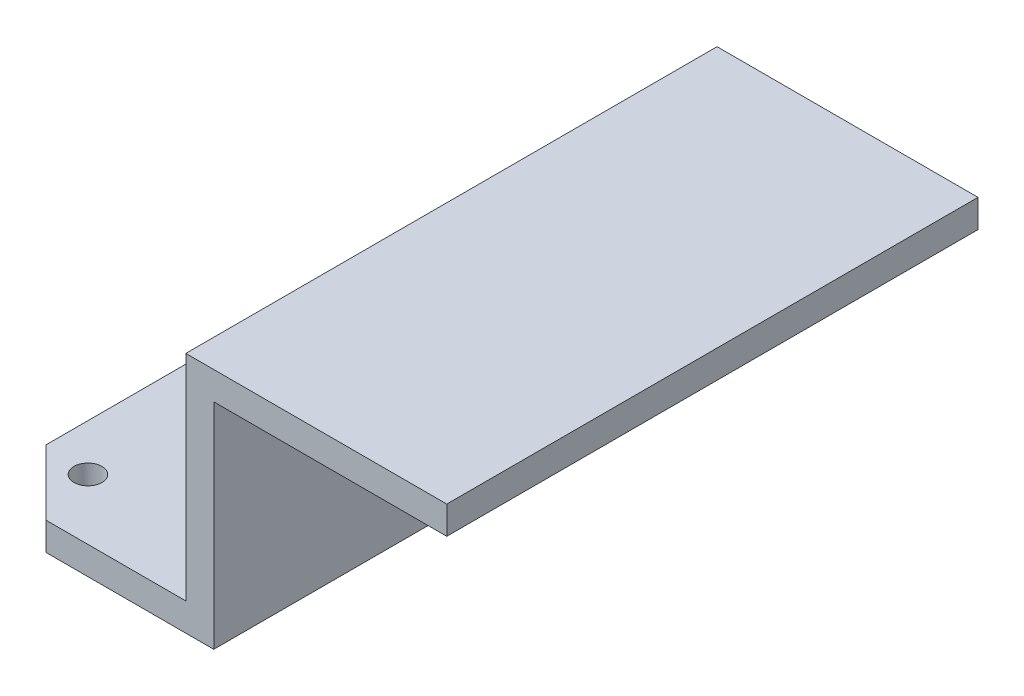
ISO-10303-21;
HEADER;
FILE_DESCRIPTION(('STEP AP214'),'2;1');
FILE_NAME('part.step','',(''),(''),'','','');
FILE_SCHEMA(('AUTOMOTIVE_DESIGN { 1 0 10303 214 1 1 1 1 }'));
ENDSEC;
DATA;
#1=APPLICATION_CONTEXT('core data for automotive mechanical design processes');
#2=APPLICATION_PROTOCOL_DEFINITION('international standard','automotive_design',2000,#1);
#3=PRODUCT_CONTEXT('',#1,'mechanical');
#4=PRODUCT('Part','Part','',(#3));
#5=PRODUCT_RELATED_PRODUCT_CATEGORY('part','',(#4));
#6=PRODUCT_DEFINITION_FORMATION('','',#4);
#7=PRODUCT_DEFINITION_CONTEXT('part definition',#1,'design');
#8=PRODUCT_DEFINITION('design','',#6,#7);
#9=PRODUCT_DEFINITION_SHAPE('','',#8);
#10=(LENGTH_UNIT() NAMED_UNIT(*) SI_UNIT(.MILLI.,.METRE.));
#11=(NAMED_UNIT(*) PLANE_ANGLE_UNIT() SI_UNIT($,.RADIAN.));
#12=(NAMED_UNIT(*) SI_UNIT($,.STERADIAN.) SOLID_ANGLE_UNIT());
#13=UNCERTAINTY_MEASURE_WITH_UNIT(LENGTH_MEASURE(1.E-05),#10,'distance_accuracy_value','');
#14=(GEOMETRIC_REPRESENTATION_CONTEXT(3) GLOBAL_UNCERTAINTY_ASSIGNED_CONTEXT((#13)) GLOBAL_UNIT_ASSIGNED_CONTEXT((#10,
#11,#12)) REPRESENTATION_CONTEXT('',''));
#15=CARTESIAN_POINT('',(0.,0.,0.));
#16=DIRECTION('',(0.,0.,1.));
#17=DIRECTION('',(1.,0.,0.));
#18=AXIS2_PLACEMENT_3D('',#15,#16,#17);
#19=CARTESIAN_POINT('',(0.,0.,57.));
#20=DIRECTION('',(0.,1.,0.));
#21=DIRECTION('',(0.,0.,1.));
#22=AXIS2_PLACEMENT_3D('',#19,#20,#21);
#23=PLANE('',#22);
#24=CARTESIAN_POINT('',(0.,0.,50.5));
#25=DIRECTION('',(0.,1.,0.));
#26=DIRECTION('',(0.,0.,1.));
#27=AXIS2_PLACEMENT_3D('',#24,#25,#26);
#28=CIRCLE('',#27,1.5);
#29=CARTESIAN_POINT('',(0.,0.,52.));
#30=VERTEX_POINT('',#29);
#31=EDGE_CURVE('E170',#30,#30,#28,.T.);
#32=ORIENTED_EDGE('',*,*,#31,.T.);
#33=EDGE_LOOP('',(#32));
#34=FACE_BOUND('',#33,.T.);
#35=CARTESIAN_POINT('',(0.,0.,6.5));
#36=DIRECTION('',(0.,1.,0.));
#37=DIRECTION('',(0.,0.,1.));
#38=AXIS2_PLACEMENT_3D('',#35,#36,#37);
#39=CIRCLE('',#38,1.5);
#40=CARTESIAN_POINT('',(0.,0.,8.));
#41=VERTEX_POINT('',#40);
#42=EDGE_CURVE('E308',#41,#41,#39,.T.);
#43=ORIENTED_EDGE('',*,*,#42,.T.);
#44=EDGE_LOOP('',(#43));
#45=FACE_BOUND('',#44,.T.);
#46=DIRECTION('',(0.,0.,-1.));
#47=VECTOR('',#46,1.);
#48=CARTESIAN_POINT('',(-5.,0.,57.));
#49=LINE('',#48,#47);
#50=CARTESIAN_POINT('',(-5.,0.,50.));
#51=VERTEX_POINT('',#50);
#52=CARTESIAN_POINT('',(-5.,0.,7.00000000000003));
#53=VERTEX_POINT('',#52);
#54=EDGE_CURVE('E166',#51,#53,#49,.T.);
#55=ORIENTED_EDGE('',*,*,#54,.T.);
#56=DIRECTION('',(0.707106781186548,0.,-0.707106781186547));
#57=VECTOR('',#56,1.);
#58=CARTESIAN_POINT('',(-5.,0.,7.00000000000001));
#59=LINE('',#58,#57);
#60=CARTESIAN_POINT('',(2.00000000000003,0.,0.));
#61=VERTEX_POINT('',#60);
#62=EDGE_CURVE('E220',#53,#61,#59,.T.);
#63=ORIENTED_EDGE('',*,*,#62,.T.);
#64=DIRECTION('',(1.,0.,0.));
#65=VECTOR('',#64,1.);
#66=CARTESIAN_POINT('',(0.,0.,0.));
#67=LINE('',#66,#65);
#68=CARTESIAN_POINT('',(20.,0.,0.));
#69=VERTEX_POINT('',#68);
#70=EDGE_CURVE('E137',#61,#69,#67,.T.);
#71=ORIENTED_EDGE('',*,*,#70,.T.);
#72=DIRECTION('',(0.,0.,-1.));
#73=VECTOR('',#72,1.);
#74=CARTESIAN_POINT('',(20.,0.,57.));
#75=LINE('',#74,#73);
#76=CARTESIAN_POINT('',(20.,0.,57.));
#77=VERTEX_POINT('',#76);
#78=EDGE_CURVE('E135',#77,#69,#75,.T.);
#79=ORIENTED_EDGE('',*,*,#78,.F.);
#80=DIRECTION('',(1.,0.,0.));
#81=VECTOR('',#80,1.);
#82=CARTESIAN_POINT('',(0.,0.,57.));
#83=LINE('',#82,#81);
#84=CARTESIAN_POINT('',(2.,0.,57.));
#85=VERTEX_POINT('',#84);
#86=EDGE_CURVE('E123',#85,#77,#83,.T.);
#87=ORIENTED_EDGE('',*,*,#86,.F.);
#88=DIRECTION('',(0.707106781186546,0.,0.707106781186549));
#89=VECTOR('',#88,1.);
#90=CARTESIAN_POINT('',(2.,0.,57.));
#91=LINE('',#90,#89);
#92=EDGE_CURVE('E217',#85,#51,#91,.F.);
#93=ORIENTED_EDGE('',*,*,#92,.T.);
#94=EDGE_LOOP('',(#55,#63,#71,#79,#87,#93));
#95=FACE_BOUND('',#94,.T.);
#96=ADVANCED_FACE('F41',(#34,#45,#95),#23,.F.);
#97=CARTESIAN_POINT('',(20.,0.,57.));
#98=DIRECTION('',(-1.,0.,0.));
#99=DIRECTION('',(0.,0.,1.));
#100=AXIS2_PLACEMENT_3D('',#97,#98,#99);
#101=PLANE('',#100);
#102=DIRECTION('',(0.,1.,0.));
#103=VECTOR('',#102,1.);
#104=CARTESIAN_POINT('',(20.,0.,0.));
#105=LINE('',#104,#103);
#106=CARTESIAN_POINT('',(20.,23.,0.));
#107=VERTEX_POINT('',#106);
#108=EDGE_CURVE('E169',#69,#107,#105,.T.);
#109=ORIENTED_EDGE('',*,*,#108,.T.);
#110=DIRECTION('',(0.,0.,-1.));
#111=VECTOR('',#110,1.);
#112=CARTESIAN_POINT('',(20.,23.,57.));
#113=LINE('',#112,#111);
#114=CARTESIAN_POINT('',(20.,23.,57.));
#115=VERTEX_POINT('',#114);
#116=EDGE_CURVE('E142',#115,#107,#113,.T.);
#117=ORIENTED_EDGE('',*,*,#116,.F.);
#118=DIRECTION('',(0.,1.,0.));
#119=VECTOR('',#118,1.);
#120=CARTESIAN_POINT('',(20.,0.,57.));
#121=LINE('',#120,#119);
#122=EDGE_CURVE('E127',#77,#115,#121,.T.);
#123=ORIENTED_EDGE('',*,*,#122,.F.);
#124=ORIENTED_EDGE('',*,*,#78,.T.);
#125=EDGE_LOOP('',(#109,#117,#123,#124));
#126=FACE_BOUND('',#125,.T.);
#127=ADVANCED_FACE('F144',(#126),#101,.F.);
#128=CARTESIAN_POINT('',(20.,23.,57.));
#129=DIRECTION('',(0.,1.,0.));
#130=DIRECTION('',(0.,0.,1.));
#131=AXIS2_PLACEMENT_3D('',#128,#129,#130);
#132=PLANE('',#131);
#133=DIRECTION('',(1.,0.,0.));
#134=VECTOR('',#133,1.);
#135=CARTESIAN_POINT('',(20.,23.,0.));
#136=LINE('',#135,#134);
#137=CARTESIAN_POINT('',(45.,23.,0.));
#138=VERTEX_POINT('',#137);
#139=EDGE_CURVE('E173',#107,#138,#136,.T.);
#140=ORIENTED_EDGE('',*,*,#139,.T.);
#141=DIRECTION('',(0.,0.,-1.));
#142=VECTOR('',#141,1.);
#143=CARTESIAN_POINT('',(45.,23.,57.));
#144=LINE('',#143,#142);
#145=CARTESIAN_POINT('',(45.,23.,57.));
#146=VERTEX_POINT('',#145);
#147=EDGE_CURVE('E205',#146,#138,#144,.T.);
#148=ORIENTED_EDGE('',*,*,#147,.F.);
#149=DIRECTION('',(1.,0.,0.));
#150=VECTOR('',#149,1.);
#151=CARTESIAN_POINT('',(20.,23.,57.));
#152=LINE('',#151,#150);
#153=EDGE_CURVE('E148',#115,#146,#152,.T.);
#154=ORIENTED_EDGE('',*,*,#153,.F.);
#155=ORIENTED_EDGE('',*,*,#116,.T.);
#156=EDGE_LOOP('',(#140,#148,#154,#155));
#157=FACE_BOUND('',#156,.T.);
#158=ADVANCED_FACE('F240',(#157),#132,.F.);
#159=CARTESIAN_POINT('',(45.,26.,57.));
#160=DIRECTION('',(-1.,0.,0.));
#161=DIRECTION('',(0.,0.,1.));
#162=AXIS2_PLACEMENT_3D('',#159,#160,#161);
#163=PLANE('',#162);
#164=DIRECTION('',(0.,1.,0.));
#165=VECTOR('',#164,1.);
#166=CARTESIAN_POINT('',(45.,26.,0.));
#167=LINE('',#166,#165);
#168=CARTESIAN_POINT('',(45.,26.,0.));
#169=VERTEX_POINT('',#168);
#170=EDGE_CURVE('E176',#138,#169,#167,.T.);
#171=ORIENTED_EDGE('',*,*,#170,.T.);
#172=DIRECTION('',(0.,0.,-1.));
#173=VECTOR('',#172,1.);
#174=CARTESIAN_POINT('',(45.,26.,57.));
#175=LINE('',#174,#173);
#176=CARTESIAN_POINT('',(45.,26.,57.));
#177=VERTEX_POINT('',#176);
#178=EDGE_CURVE('E201',#177,#169,#175,.T.);
#179=ORIENTED_EDGE('',*,*,#178,.F.);
#180=DIRECTION('',(0.,1.,0.));
#181=VECTOR('',#180,1.);
#182=CARTESIAN_POINT('',(45.,26.,57.));
#183=LINE('',#182,#181);
#184=EDGE_CURVE('E151',#146,#177,#183,.T.);
#185=ORIENTED_EDGE('',*,*,#184,.F.);
#186=ORIENTED_EDGE('',*,*,#147,.T.);
#187=EDGE_LOOP('',(#171,#179,#185,#186));
#188=FACE_BOUND('',#187,.T.);
#189=ADVANCED_FACE('F247',(#188),#163,.F.);
#190=CARTESIAN_POINT('',(17.,26.,57.));
#191=DIRECTION('',(0.,-1.,0.));
#192=DIRECTION('',(0.,0.,-1.));
#193=AXIS2_PLACEMENT_3D('',#190,#191,#192);
#194=PLANE('',#193);
#195=DIRECTION('',(-1.,0.,0.));
#196=VECTOR('',#195,1.);
#197=CARTESIAN_POINT('',(17.,26.,0.));
#198=LINE('',#197,#196);
#199=CARTESIAN_POINT('',(17.,26.,0.));
#200=VERTEX_POINT('',#199);
#201=EDGE_CURVE('E179',#169,#200,#198,.T.);
#202=ORIENTED_EDGE('',*,*,#201,.T.);
#203=DIRECTION('',(0.,0.,-1.));
#204=VECTOR('',#203,1.);
#205=CARTESIAN_POINT('',(17.,26.,57.));
#206=LINE('',#205,#204);
#207=CARTESIAN_POINT('',(17.,26.,57.));
#208=VERTEX_POINT('',#207);
#209=EDGE_CURVE('E197',#208,#200,#206,.T.);
#210=ORIENTED_EDGE('',*,*,#209,.F.);
#211=DIRECTION('',(-1.,0.,0.));
#212=VECTOR('',#211,1.);
#213=CARTESIAN_POINT('',(17.,26.,57.));
#214=LINE('',#213,#212);
#215=EDGE_CURVE('E157',#177,#208,#214,.T.);
#216=ORIENTED_EDGE('',*,*,#215,.F.);
#217=ORIENTED_EDGE('',*,*,#178,.T.);
#218=EDGE_LOOP('',(#202,#210,#216,#217));
#219=FACE_BOUND('',#218,.T.);
#220=ADVANCED_FACE('F250',(#219),#194,.F.);
#221=CARTESIAN_POINT('',(17.,3.,57.));
#222=DIRECTION('',(1.,0.,0.));
#223=DIRECTION('',(0.,0.,-1.));
#224=AXIS2_PLACEMENT_3D('',#221,#222,#223);
#225=PLANE('',#224);
#226=DIRECTION('',(0.,-1.,0.));
#227=VECTOR('',#226,1.);
#228=CARTESIAN_POINT('',(17.,3.,0.));
#229=LINE('',#228,#227);
#230=CARTESIAN_POINT('',(17.,3.,0.));
#231=VERTEX_POINT('',#230);
#232=EDGE_CURVE('E182',#200,#231,#229,.T.);
#233=ORIENTED_EDGE('',*,*,#232,.T.);
#234=DIRECTION('',(0.,0.,-1.));
#235=VECTOR('',#234,1.);
#236=CARTESIAN_POINT('',(17.,3.,57.));
#237=LINE('',#236,#235);
#238=CARTESIAN_POINT('',(17.,3.,57.));
#239=VERTEX_POINT('',#238);
#240=EDGE_CURVE('E193',#239,#231,#237,.T.);
#241=ORIENTED_EDGE('',*,*,#240,.F.);
#242=DIRECTION('',(0.,-1.,0.));
#243=VECTOR('',#242,1.);
#244=CARTESIAN_POINT('',(17.,3.,57.));
#245=LINE('',#244,#243);
#246=EDGE_CURVE('E160',#208,#239,#245,.T.);
#247=ORIENTED_EDGE('',*,*,#246,.F.);
#248=ORIENTED_EDGE('',*,*,#209,.T.);
#249=EDGE_LOOP('',(#233,#241,#247,#248));
#250=FACE_BOUND('',#249,.T.);
#251=ADVANCED_FACE('F255',(#250),#225,.F.);
#252=CARTESIAN_POINT('',(-5.,3.,57.));
#253=DIRECTION('',(0.,-1.,0.));
#254=DIRECTION('',(0.,0.,-1.));
#255=AXIS2_PLACEMENT_3D('',#252,#253,#254);
#256=PLANE('',#255);
#257=CARTESIAN_POINT('',(0.,3.,50.5));
#258=DIRECTION('',(0.,1.,0.));
#259=DIRECTION('',(0.,0.,1.));
#260=AXIS2_PLACEMENT_3D('',#257,#258,#259);
#261=CIRCLE('',#260,1.5);
#262=CARTESIAN_POINT('',(0.,3.,52.));
#263=VERTEX_POINT('',#262);
#264=EDGE_CURVE('E305',#263,#263,#261,.T.);
#265=ORIENTED_EDGE('',*,*,#264,.F.);
#266=EDGE_LOOP('',(#265));
#267=FACE_BOUND('',#266,.T.);
#268=CARTESIAN_POINT('',(0.,3.,6.5));
#269=DIRECTION('',(0.,1.,0.));
#270=DIRECTION('',(0.,0.,1.));
#271=AXIS2_PLACEMENT_3D('',#268,#269,#270);
#272=CIRCLE('',#271,1.5);
#273=CARTESIAN_POINT('',(0.,3.,8.));
#274=VERTEX_POINT('',#273);
#275=EDGE_CURVE('E313',#274,#274,#272,.T.);
#276=ORIENTED_EDGE('',*,*,#275,.F.);
#277=EDGE_LOOP('',(#276));
#278=FACE_BOUND('',#277,.T.);
#279=DIRECTION('',(-1.,0.,0.));
#280=VECTOR('',#279,1.);
#281=CARTESIAN_POINT('',(-5.,3.,0.));
#282=LINE('',#281,#280);
#283=CARTESIAN_POINT('',(2.00000000000003,3.,0.));
#284=VERTEX_POINT('',#283);
#285=EDGE_CURVE('E132',#231,#284,#282,.T.);
#286=ORIENTED_EDGE('',*,*,#285,.T.);
#287=DIRECTION('',(-0.707106781186548,0.,0.707106781186547));
#288=VECTOR('',#287,1.);
#289=CARTESIAN_POINT('',(-5.,3.,7.00000000000001));
#290=LINE('',#289,#288);
#291=CARTESIAN_POINT('',(-5.,3.,7.00000000000003));
#292=VERTEX_POINT('',#291);
#293=EDGE_CURVE('E51',#284,#292,#290,.T.);
#294=ORIENTED_EDGE('',*,*,#293,.T.);
#295=DIRECTION('',(0.,0.,-1.));
#296=VECTOR('',#295,1.);
#297=CARTESIAN_POINT('',(-5.,3.,57.));
#298=LINE('',#297,#296);
#299=CARTESIAN_POINT('',(-5.,3.,50.));
#300=VERTEX_POINT('',#299);
#301=EDGE_CURVE('E189',#300,#292,#298,.T.);
#302=ORIENTED_EDGE('',*,*,#301,.F.);
#303=DIRECTION('',(-0.707106781186546,0.,-0.707106781186549));
#304=VECTOR('',#303,1.);
#305=CARTESIAN_POINT('',(2.,3.,57.));
#306=LINE('',#305,#304);
#307=CARTESIAN_POINT('',(2.,3.,57.));
#308=VERTEX_POINT('',#307);
#309=EDGE_CURVE('E58',#300,#308,#306,.F.);
#310=ORIENTED_EDGE('',*,*,#309,.T.);
#311=DIRECTION('',(-1.,0.,0.));
#312=VECTOR('',#311,1.);
#313=CARTESIAN_POINT('',(-5.,3.,57.));
#314=LINE('',#313,#312);
#315=EDGE_CURVE('E163',#239,#308,#314,.T.);
#316=ORIENTED_EDGE('',*,*,#315,.F.);
#317=ORIENTED_EDGE('',*,*,#240,.T.);
#318=EDGE_LOOP('',(#286,#294,#302,#310,#316,#317));
#319=FACE_BOUND('',#318,.T.);
#320=ADVANCED_FACE('F228',(#267,#278,#319),#256,.F.);
#321=CARTESIAN_POINT('',(-5.,0.,57.));
#322=DIRECTION('',(1.,0.,0.));
#323=DIRECTION('',(0.,0.,-1.));
#324=AXIS2_PLACEMENT_3D('',#321,#322,#323);
#325=PLANE('',#324);
#326=ORIENTED_EDGE('',*,*,#301,.T.);
#327=DIRECTION('',(0.,-1.,0.));
#328=VECTOR('',#327,1.);
#329=CARTESIAN_POINT('',(-5.,0.,7.00000000000001));
#330=LINE('',#329,#328);
#331=EDGE_CURVE('E213',#292,#53,#330,.T.);
#332=ORIENTED_EDGE('',*,*,#331,.T.);
#333=ORIENTED_EDGE('',*,*,#54,.F.);
#334=DIRECTION('',(0.,1.,0.));
#335=VECTOR('',#334,1.);
#336=CARTESIAN_POINT('',(-5.,0.,50.));
#337=LINE('',#336,#335);
#338=EDGE_CURVE('E141',#51,#300,#337,.T.);
#339=ORIENTED_EDGE('',*,*,#338,.T.);
#340=EDGE_LOOP('',(#326,#332,#333,#339));
#341=FACE_BOUND('',#340,.T.);
#342=ADVANCED_FACE('F232',(#341),#325,.F.);
#343=CARTESIAN_POINT('',(0.,0.,57.));
#344=DIRECTION('',(0.,0.,-1.));
#345=DIRECTION('',(-1.,0.,0.));
#346=AXIS2_PLACEMENT_3D('',#343,#344,#345);
#347=PLANE('',#346);
#348=ORIENTED_EDGE('',*,*,#315,.T.);
#349=DIRECTION('',(0.,-1.,0.));
#350=VECTOR('',#349,1.);
#351=CARTESIAN_POINT('',(2.,0.,57.));
#352=LINE('',#351,#350);
#353=EDGE_CURVE('E11',#308,#85,#352,.T.);
#354=ORIENTED_EDGE('',*,*,#353,.T.);
#355=ORIENTED_EDGE('',*,*,#86,.T.);
#356=ORIENTED_EDGE('',*,*,#122,.T.);
#357=ORIENTED_EDGE('',*,*,#153,.T.);
#358=ORIENTED_EDGE('',*,*,#184,.T.);
#359=ORIENTED_EDGE('',*,*,#215,.T.);
#360=ORIENTED_EDGE('',*,*,#246,.T.);
#361=EDGE_LOOP('',(#348,#354,#355,#356,#357,#358,#359,#360));
#362=FACE_BOUND('',#361,.T.);
#363=ADVANCED_FACE('F125',(#362),#347,.F.);
#364=CARTESIAN_POINT('',(0.,0.,0.));
#365=DIRECTION('',(0.,0.,-1.));
#366=DIRECTION('',(-1.,0.,0.));
#367=AXIS2_PLACEMENT_3D('',#364,#365,#366);
#368=PLANE('',#367);
#369=ORIENTED_EDGE('',*,*,#70,.F.);
#370=DIRECTION('',(0.,1.,0.));
#371=VECTOR('',#370,1.);
#372=CARTESIAN_POINT('',(2.00000000000003,3.,0.));
#373=LINE('',#372,#371);
#374=EDGE_CURVE('E66',#61,#284,#373,.T.);
#375=ORIENTED_EDGE('',*,*,#374,.T.);
#376=ORIENTED_EDGE('',*,*,#285,.F.);
#377=ORIENTED_EDGE('',*,*,#232,.F.);
#378=ORIENTED_EDGE('',*,*,#201,.F.);
#379=ORIENTED_EDGE('',*,*,#170,.F.);
#380=ORIENTED_EDGE('',*,*,#139,.F.);
#381=ORIENTED_EDGE('',*,*,#108,.F.);
#382=EDGE_LOOP('',(#369,#375,#376,#377,#378,#379,#380,#381));
#383=FACE_BOUND('',#382,.T.);
#384=ADVANCED_FACE('F236',(#383),#368,.T.);
#385=CARTESIAN_POINT('',(0.,-54.,6.5));
#386=DIRECTION('',(0.,1.,0.));
#387=DIRECTION('',(0.,0.,1.));
#388=AXIS2_PLACEMENT_3D('',#385,#386,#387);
#389=CYLINDRICAL_SURFACE('',#388,1.5);
#390=CARTESIAN_POINT('',(0.,3.,8.));
#391=CARTESIAN_POINT('',(0.,2.96875,8.));
#392=CARTESIAN_POINT('',(0.,2.9375,8.));
#393=CARTESIAN_POINT('',(0.,2.875,8.));
#394=CARTESIAN_POINT('',(0.,2.84375,8.));
#395=CARTESIAN_POINT('',(0.,2.78125,8.));
#396=CARTESIAN_POINT('',(0.,2.75,8.));
#397=CARTESIAN_POINT('',(0.,2.6875,8.));
#398=CARTESIAN_POINT('',(0.,2.65625,8.));
#399=CARTESIAN_POINT('',(0.,2.59375,8.));
#400=CARTESIAN_POINT('',(0.,2.5625,8.));
#401=CARTESIAN_POINT('',(0.,2.5,8.));
#402=CARTESIAN_POINT('',(0.,2.46875,8.));
#403=CARTESIAN_POINT('',(0.,2.40625,8.));
#404=CARTESIAN_POINT('',(0.,2.375,8.));
#405=CARTESIAN_POINT('',(0.,2.3125,8.));
#406=CARTESIAN_POINT('',(0.,2.28125,8.));
#407=CARTESIAN_POINT('',(0.,2.21875,8.));
#408=CARTESIAN_POINT('',(0.,2.1875,8.));
#409=CARTESIAN_POINT('',(0.,2.125,8.));
#410=CARTESIAN_POINT('',(0.,2.09375,8.));
#411=CARTESIAN_POINT('',(0.,2.03125,8.));
#412=CARTESIAN_POINT('',(0.,2.,8.));
#413=CARTESIAN_POINT('',(0.,1.9375,8.));
#414=CARTESIAN_POINT('',(0.,1.90625,8.));
#415=CARTESIAN_POINT('',(0.,1.84375,8.));
#416=CARTESIAN_POINT('',(0.,1.8125,8.));
#417=CARTESIAN_POINT('',(0.,1.75,8.));
#418=CARTESIAN_POINT('',(0.,1.71875,8.));
#419=CARTESIAN_POINT('',(0.,1.65625,8.));
#420=CARTESIAN_POINT('',(0.,1.625,8.));
#421=CARTESIAN_POINT('',(0.,1.5625,8.));
#422=CARTESIAN_POINT('',(0.,1.53125,8.));
#423=CARTESIAN_POINT('',(0.,1.46875,8.));
#424=CARTESIAN_POINT('',(0.,1.4375,8.));
#425=CARTESIAN_POINT('',(0.,1.375,8.));
#426=CARTESIAN_POINT('',(0.,1.34375,8.));
#427=CARTESIAN_POINT('',(0.,1.28125,8.));
#428=CARTESIAN_POINT('',(0.,1.25,8.));
#429=CARTESIAN_POINT('',(0.,1.1875,8.));
#430=CARTESIAN_POINT('',(0.,1.15625,8.));
#431=CARTESIAN_POINT('',(0.,1.09375,8.));
#432=CARTESIAN_POINT('',(0.,1.0625,8.));
#433=CARTESIAN_POINT('',(0.,0.999999999999999,8.));
#434=CARTESIAN_POINT('',(0.,0.96875,8.));
#435=CARTESIAN_POINT('',(0.,0.906250000000002,8.));
#436=CARTESIAN_POINT('',(0.,0.875000000000003,8.));
#437=CARTESIAN_POINT('',(0.,0.812500000000003,8.));
#438=CARTESIAN_POINT('',(0.,0.781250000000002,8.));
#439=CARTESIAN_POINT('',(0.,0.718749999999999,8.));
#440=CARTESIAN_POINT('',(0.,0.687499999999998,8.));
#441=CARTESIAN_POINT('',(0.,0.624999999999998,8.));
#442=CARTESIAN_POINT('',(0.,0.593749999999999,8.));
#443=CARTESIAN_POINT('',(0.,0.531250000000002,8.));
#444=CARTESIAN_POINT('',(0.,0.500000000000003,8.));
#445=CARTESIAN_POINT('',(0.,0.437500000000003,8.));
#446=CARTESIAN_POINT('',(0.,0.406250000000002,8.));
#447=CARTESIAN_POINT('',(0.,0.343749999999999,8.));
#448=CARTESIAN_POINT('',(0.,0.312499999999998,8.));
#449=CARTESIAN_POINT('',(0.,0.249999999999998,8.));
#450=CARTESIAN_POINT('',(0.,0.218749999999999,8.));
#451=CARTESIAN_POINT('',(0.,0.156250000000001,8.));
#452=CARTESIAN_POINT('',(0.,0.125000000000002,8.));
#453=CARTESIAN_POINT('',(0.,0.0625000000000024,8.));
#454=CARTESIAN_POINT('',(0.,0.0312500000000012,8.));
#455=CARTESIAN_POINT('',(0.,0.,8.));
#456=B_SPLINE_CURVE_WITH_KNOTS('',3,(#390,#391,#392,#393,#394,#395,#396,#397,#398,#399,#400,
#401,#402,#403,#404,#405,#406,#407,#408,#409,#410,#411,#412,#413,#414,#415,#416,#417,#418,#419,
#420,#421,#422,#423,#424,#425,#426,#427,#428,#429,#430,#431,#432,#433,#434,#435,#436,#437,#438,
#439,#440,#441,#442,#443,#444,#445,#446,#447,#448,#449,#450,#451,#452,#453,#454,#455),
.UNSPECIFIED.,.F.,.F.,(4,2,2,2,2,2,2,2,2,2,2,2,2,2,2,2,2,2,2,2,2,2,2,2,2,2,2,2,2,2,2,2,4),(0.,
0.0937500000000036,0.1875,0.281249999999997,0.375,0.468750000000004,0.5625,0.656249999999997,
0.750000000000001,0.843750000000004,0.937500000000001,1.03125,1.125,1.21875,1.3125,1.40625,1.5,
1.59375,1.6875,1.78125,1.875,1.96875000000001,2.0625,2.15625,2.25,2.34375000000001,2.4375,
2.53125,2.625,2.71875000000001,2.8125,2.90625,3.),.UNSPECIFIED.);
#457=EDGE_CURVE('BSEAM292',#274,#41,#456,.T.);
#458=ORIENTED_EDGE('',*,*,#275,.T.);
#459=ORIENTED_EDGE('',*,*,#42,.F.);
#460=ORIENTED_EDGE('',*,*,#457,.T.);
#461=ORIENTED_EDGE('',*,*,#457,.F.);
#462=EDGE_LOOP('',(#458,#460,#459,#461));
#463=FACE_BOUND('',#462,.T.);
#464=ADVANCED_FACE('F292',(#463),#389,.F.);
#465=CARTESIAN_POINT('',(0.,-54.,50.5));
#466=DIRECTION('',(0.,1.,0.));
#467=DIRECTION('',(0.,0.,1.));
#468=AXIS2_PLACEMENT_3D('',#465,#466,#467);
#469=CYLINDRICAL_SURFACE('',#468,1.5);
#470=CARTESIAN_POINT('',(0.,3.,52.));
#471=CARTESIAN_POINT('',(0.,2.96875,52.));
#472=CARTESIAN_POINT('',(0.,2.9375,52.));
#473=CARTESIAN_POINT('',(0.,2.875,52.));
#474=CARTESIAN_POINT('',(0.,2.84375,52.));
#475=CARTESIAN_POINT('',(0.,2.78125,52.));
#476=CARTESIAN_POINT('',(0.,2.75,52.));
#477=CARTESIAN_POINT('',(0.,2.6875,52.));
#478=CARTESIAN_POINT('',(0.,2.65625,52.));
#479=CARTESIAN_POINT('',(0.,2.59375,52.));
#480=CARTESIAN_POINT('',(0.,2.5625,52.));
#481=CARTESIAN_POINT('',(0.,2.5,52.));
#482=CARTESIAN_POINT('',(0.,2.46875,52.));
#483=CARTESIAN_POINT('',(0.,2.40625,52.));
#484=CARTESIAN_POINT('',(0.,2.375,52.));
#485=CARTESIAN_POINT('',(0.,2.3125,52.));
#486=CARTESIAN_POINT('',(0.,2.28125,52.));
#487=CARTESIAN_POINT('',(0.,2.21875,52.));
#488=CARTESIAN_POINT('',(0.,2.1875,52.));
#489=CARTESIAN_POINT('',(0.,2.125,52.));
#490=CARTESIAN_POINT('',(0.,2.09375,52.));
#491=CARTESIAN_POINT('',(0.,2.03125,52.));
#492=CARTESIAN_POINT('',(0.,2.,52.));
#493=CARTESIAN_POINT('',(0.,1.9375,52.));
#494=CARTESIAN_POINT('',(0.,1.90625,52.));
#495=CARTESIAN_POINT('',(0.,1.84375,52.));
#496=CARTESIAN_POINT('',(0.,1.8125,52.));
#497=CARTESIAN_POINT('',(0.,1.75,52.));
#498=CARTESIAN_POINT('',(0.,1.71875,52.));
#499=CARTESIAN_POINT('',(0.,1.65625,52.));
#500=CARTESIAN_POINT('',(0.,1.625,52.));
#501=CARTESIAN_POINT('',(0.,1.5625,52.));
#502=CARTESIAN_POINT('',(0.,1.53125,52.));
#503=CARTESIAN_POINT('',(0.,1.46875,52.));
#504=CARTESIAN_POINT('',(0.,1.4375,52.));
#505=CARTESIAN_POINT('',(0.,1.375,52.));
#506=CARTESIAN_POINT('',(0.,1.34375,52.));
#507=CARTESIAN_POINT('',(0.,1.28125,52.));
#508=CARTESIAN_POINT('',(0.,1.25,52.));
#509=CARTESIAN_POINT('',(0.,1.1875,52.));
#510=CARTESIAN_POINT('',(0.,1.15625,52.));
#511=CARTESIAN_POINT('',(0.,1.09375,52.));
#512=CARTESIAN_POINT('',(0.,1.0625,52.));
#513=CARTESIAN_POINT('',(0.,0.999999999999999,52.));
#514=CARTESIAN_POINT('',(0.,0.96875,52.));
#515=CARTESIAN_POINT('',(0.,0.906250000000002,52.));
#516=CARTESIAN_POINT('',(0.,0.875000000000003,52.));
#517=CARTESIAN_POINT('',(0.,0.812500000000003,52.));
#518=CARTESIAN_POINT('',(0.,0.781250000000002,52.));
#519=CARTESIAN_POINT('',(0.,0.718749999999999,52.));
#520=CARTESIAN_POINT('',(0.,0.687499999999998,52.));
#521=CARTESIAN_POINT('',(0.,0.624999999999998,52.));
#522=CARTESIAN_POINT('',(0.,0.593749999999999,52.));
#523=CARTESIAN_POINT('',(0.,0.531250000000002,52.));
#524=CARTESIAN_POINT('',(0.,0.500000000000003,52.));
#525=CARTESIAN_POINT('',(0.,0.437500000000003,52.));
#526=CARTESIAN_POINT('',(0.,0.406250000000002,52.));
#527=CARTESIAN_POINT('',(0.,0.343749999999999,52.));
#528=CARTESIAN_POINT('',(0.,0.312499999999998,52.));
#529=CARTESIAN_POINT('',(0.,0.249999999999998,52.));
#530=CARTESIAN_POINT('',(0.,0.218749999999999,52.));
#531=CARTESIAN_POINT('',(0.,0.156250000000001,52.));
#532=CARTESIAN_POINT('',(0.,0.125000000000002,52.));
#533=CARTESIAN_POINT('',(0.,0.0625000000000024,52.));
#534=CARTESIAN_POINT('',(0.,0.0312500000000012,52.));
#535=CARTESIAN_POINT('',(0.,0.,52.));
#536=B_SPLINE_CURVE_WITH_KNOTS('',3,(#470,#471,#472,#473,#474,#475,#476,#477,#478,#479,#480,
#481,#482,#483,#484,#485,#486,#487,#488,#489,#490,#491,#492,#493,#494,#495,#496,#497,#498,#499,
#500,#501,#502,#503,#504,#505,#506,#507,#508,#509,#510,#511,#512,#513,#514,#515,#516,#517,#518,
#519,#520,#521,#522,#523,#524,#525,#526,#527,#528,#529,#530,#531,#532,#533,#534,#535),
.UNSPECIFIED.,.F.,.F.,(4,2,2,2,2,2,2,2,2,2,2,2,2,2,2,2,2,2,2,2,2,2,2,2,2,2,2,2,2,2,2,2,4),(0.,
0.0937500000000036,0.1875,0.281249999999997,0.375,0.468750000000004,0.5625,0.656249999999997,
0.750000000000001,0.843750000000004,0.937500000000001,1.03125,1.125,1.21875,1.3125,1.40625,1.5,
1.59375,1.6875,1.78125,1.875,1.96875000000001,2.0625,2.15625,2.25,2.34375000000001,2.4375,
2.53125,2.625,2.71875000000001,2.8125,2.90625,3.),.UNSPECIFIED.);
#537=EDGE_CURVE('BSEAM261',#263,#30,#536,.T.);
#538=ORIENTED_EDGE('',*,*,#264,.T.);
#539=ORIENTED_EDGE('',*,*,#31,.F.);
#540=ORIENTED_EDGE('',*,*,#537,.T.);
#541=ORIENTED_EDGE('',*,*,#537,.F.);
#542=EDGE_LOOP('',(#538,#540,#539,#541));
#543=FACE_BOUND('',#542,.T.);
#544=ADVANCED_FACE('F261',(#543),#469,.F.);
#545=CARTESIAN_POINT('',(-5.,0.,7.00000000000001));
#546=DIRECTION('',(-0.707106781186547,0.,-0.707106781186548));
#547=DIRECTION('',(0.,1.,0.));
#548=AXIS2_PLACEMENT_3D('',#545,#546,#547);
#549=PLANE('',#548);
#550=ORIENTED_EDGE('',*,*,#293,.F.);
#551=ORIENTED_EDGE('',*,*,#374,.F.);
#552=ORIENTED_EDGE('',*,*,#62,.F.);
#553=ORIENTED_EDGE('',*,*,#331,.F.);
#554=EDGE_LOOP('',(#550,#551,#552,#553));
#555=FACE_BOUND('',#554,.T.);
#556=ADVANCED_FACE('F235',(#555),#549,.T.);
#557=CARTESIAN_POINT('',(2.,0.,57.));
#558=DIRECTION('',(0.707106781186549,0.,-0.707106781186546));
#559=DIRECTION('',(0.,-1.,0.));
#560=AXIS2_PLACEMENT_3D('',#557,#558,#559);
#561=PLANE('',#560);
#562=ORIENTED_EDGE('',*,*,#309,.F.);
#563=ORIENTED_EDGE('',*,*,#338,.F.);
#564=ORIENTED_EDGE('',*,*,#92,.F.);
#565=ORIENTED_EDGE('',*,*,#353,.F.);
#566=EDGE_LOOP('',(#562,#563,#564,#565));
#567=FACE_BOUND('',#566,.T.);
#568=ADVANCED_FACE('F44',(#567),#561,.F.);
#569=CLOSED_SHELL('',(#96,#127,#158,#189,#220,#251,#320,#342,#363,#384,#464,#544,#556,#568));
#570=MANIFOLD_SOLID_BREP('B2',#569);
#571=ADVANCED_BREP_SHAPE_REPRESENTATION('',(#18,#570),#14);
#572=SHAPE_DEFINITION_REPRESENTATION(#9,#571);
ENDSEC;
END-ISO-10303-21;
